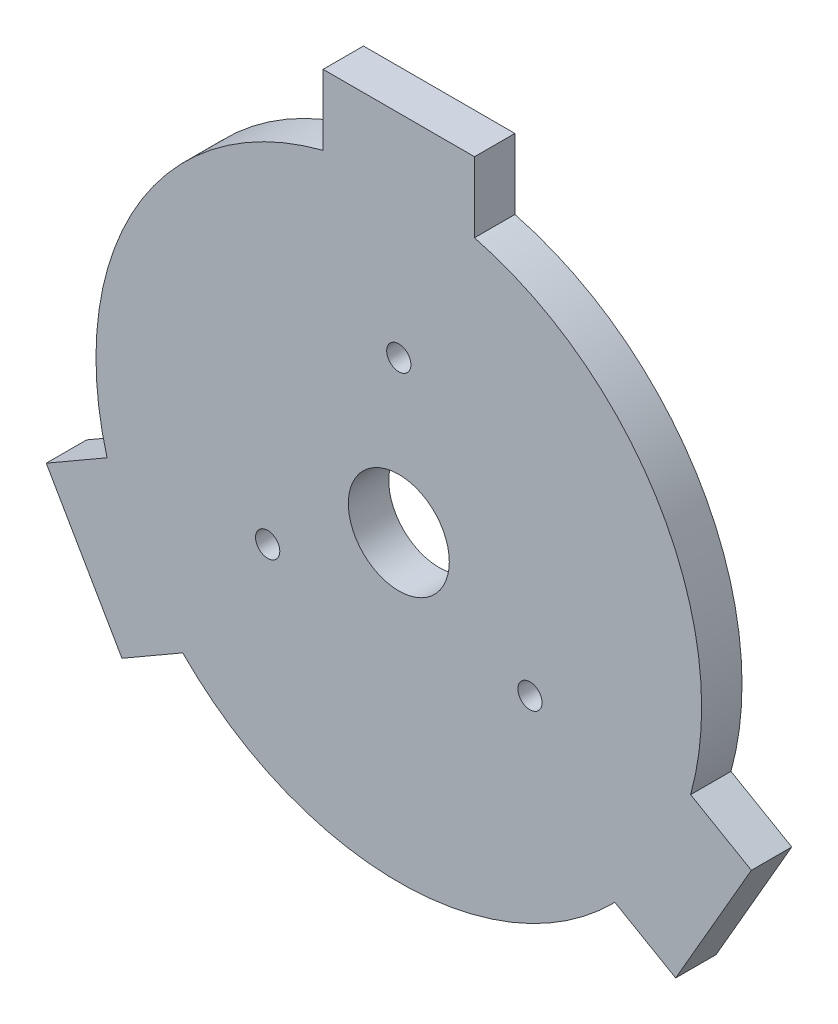
ISO-10303-21;
HEADER;
FILE_DESCRIPTION(('STEP AP214'),'2;1');
FILE_NAME('part.step','',(''),(''),'','','');
FILE_SCHEMA(('AUTOMOTIVE_DESIGN { 1 0 10303 214 1 1 1 1 }'));
ENDSEC;
DATA;
#1=APPLICATION_CONTEXT('core data for automotive mechanical design processes');
#2=APPLICATION_PROTOCOL_DEFINITION('international standard','automotive_design',2000,#1);
#3=PRODUCT_CONTEXT('',#1,'mechanical');
#4=PRODUCT('Part','Part','',(#3));
#5=PRODUCT_RELATED_PRODUCT_CATEGORY('part','',(#4));
#6=PRODUCT_DEFINITION_FORMATION('','',#4);
#7=PRODUCT_DEFINITION_CONTEXT('part definition',#1,'design');
#8=PRODUCT_DEFINITION('design','',#6,#7);
#9=PRODUCT_DEFINITION_SHAPE('','',#8);
#10=(LENGTH_UNIT() NAMED_UNIT(*) SI_UNIT(.MILLI.,.METRE.));
#11=(NAMED_UNIT(*) PLANE_ANGLE_UNIT() SI_UNIT($,.RADIAN.));
#12=(NAMED_UNIT(*) SI_UNIT($,.STERADIAN.) SOLID_ANGLE_UNIT());
#13=UNCERTAINTY_MEASURE_WITH_UNIT(LENGTH_MEASURE(1.E-05),#10,'distance_accuracy_value','');
#14=(GEOMETRIC_REPRESENTATION_CONTEXT(3) GLOBAL_UNCERTAINTY_ASSIGNED_CONTEXT((#13)) GLOBAL_UNIT_ASSIGNED_CONTEXT((#10,
#11,#12)) REPRESENTATION_CONTEXT('',''));
#15=CARTESIAN_POINT('',(0.,0.,0.));
#16=DIRECTION('',(0.,0.,1.));
#17=DIRECTION('',(1.,0.,0.));
#18=AXIS2_PLACEMENT_3D('',#15,#16,#17);
#19=CARTESIAN_POINT('',(0.,0.,4.));
#20=DIRECTION('',(0.,0.,1.));
#21=DIRECTION('',(1.,0.,0.));
#22=AXIS2_PLACEMENT_3D('',#19,#20,#21);
#23=PLANE('',#22);
#24=CARTESIAN_POINT('',(0.,15.,4.));
#25=DIRECTION('',(0.,0.,1.));
#26=DIRECTION('',(1.,0.,0.));
#27=AXIS2_PLACEMENT_3D('',#24,#25,#26);
#28=CIRCLE('',#27,1.2);
#29=CARTESIAN_POINT('',(1.2,15.,4.));
#30=VERTEX_POINT('',#29);
#31=EDGE_CURVE('E176',#30,#30,#28,.T.);
#32=ORIENTED_EDGE('',*,*,#31,.F.);
#33=EDGE_LOOP('',(#32));
#34=FACE_BOUND('',#33,.T.);
#35=CARTESIAN_POINT('',(-12.9903810567665,-7.50000000000006,4.));
#36=DIRECTION('',(0.,0.,1.));
#37=DIRECTION('',(1.,0.,0.));
#38=AXIS2_PLACEMENT_3D('',#35,#36,#37);
#39=CIRCLE('',#38,1.2);
#40=CARTESIAN_POINT('',(-11.7903810567665,-7.50000000000006,4.));
#41=VERTEX_POINT('',#40);
#42=EDGE_CURVE('E166',#41,#41,#39,.T.);
#43=ORIENTED_EDGE('',*,*,#42,.F.);
#44=EDGE_LOOP('',(#43));
#45=FACE_BOUND('',#44,.T.);
#46=CARTESIAN_POINT('',(12.9903810567665,-7.50000000000006,4.));
#47=DIRECTION('',(0.,0.,1.));
#48=DIRECTION('',(1.,0.,0.));
#49=AXIS2_PLACEMENT_3D('',#46,#47,#48);
#50=CIRCLE('',#49,1.2);
#51=CARTESIAN_POINT('',(14.1903810567665,-7.50000000000006,4.));
#52=VERTEX_POINT('',#51);
#53=EDGE_CURVE('E163',#52,#52,#50,.T.);
#54=ORIENTED_EDGE('',*,*,#53,.F.);
#55=EDGE_LOOP('',(#54));
#56=FACE_BOUND('',#55,.T.);
#57=CARTESIAN_POINT('',(0.,0.,4.));
#58=DIRECTION('',(0.,0.,1.));
#59=DIRECTION('',(1.,0.,0.));
#60=AXIS2_PLACEMENT_3D('',#57,#58,#59);
#61=CIRCLE('',#60,5.);
#62=CARTESIAN_POINT('',(5.,0.,4.));
#63=VERTEX_POINT('',#62);
#64=EDGE_CURVE('E224',#63,#63,#61,.T.);
#65=ORIENTED_EDGE('',*,*,#64,.F.);
#66=EDGE_LOOP('',(#65));
#67=FACE_BOUND('',#66,.T.);
#68=DIRECTION('',(0.866025403784438,-0.500000000000002,0.));
#69=VECTOR('',#68,1.);
#70=CARTESIAN_POINT('',(3.74999999999996,6.4951905283832,4.));
#71=LINE('',#70,#69);
#72=CARTESIAN_POINT('',(28.9057647468726,-8.02849701989467,4.));
#73=VERTEX_POINT('',#72);
#74=CARTESIAN_POINT('',(34.9269145362397,-11.5048094716169,4.));
#75=VERTEX_POINT('',#74);
#76=EDGE_CURVE('E134',#73,#75,#71,.T.);
#77=ORIENTED_EDGE('',*,*,#76,.F.);
#78=CARTESIAN_POINT('',(0.,0.,4.));
#79=DIRECTION('',(0.,0.,1.));
#80=DIRECTION('',(1.,0.,0.));
#81=AXIS2_PLACEMENT_3D('',#78,#79,#80);
#82=CIRCLE('',#81,30.);
#83=CARTESIAN_POINT('',(7.5,29.0473750965556,4.));
#84=VERTEX_POINT('',#83);
#85=EDGE_CURVE('E159',#73,#84,#82,.T.);
#86=ORIENTED_EDGE('',*,*,#85,.T.);
#87=DIRECTION('',(0.,-1.,0.));
#88=VECTOR('',#87,1.);
#89=CARTESIAN_POINT('',(7.5,0.,4.));
#90=LINE('',#89,#88);
#91=CARTESIAN_POINT('',(7.5,36.,4.));
#92=VERTEX_POINT('',#91);
#93=EDGE_CURVE('E220',#92,#84,#90,.T.);
#94=ORIENTED_EDGE('',*,*,#93,.F.);
#95=DIRECTION('',(-1.,0.,0.));
#96=VECTOR('',#95,1.);
#97=CARTESIAN_POINT('',(-10.,36.,4.));
#98=LINE('',#97,#96);
#99=CARTESIAN_POINT('',(-7.5,36.,4.));
#100=VERTEX_POINT('',#99);
#101=EDGE_CURVE('E153',#92,#100,#98,.T.);
#102=ORIENTED_EDGE('',*,*,#101,.T.);
#103=DIRECTION('',(0.,1.,0.));
#104=VECTOR('',#103,1.);
#105=CARTESIAN_POINT('',(-7.5,0.,4.));
#106=LINE('',#105,#104);
#107=CARTESIAN_POINT('',(-7.5,29.0473750965556,4.));
#108=VERTEX_POINT('',#107);
#109=EDGE_CURVE('E218',#108,#100,#106,.T.);
#110=ORIENTED_EDGE('',*,*,#109,.F.);
#111=CARTESIAN_POINT('',(0.,0.,4.));
#112=DIRECTION('',(0.,0.,1.));
#113=DIRECTION('',(1.,0.,0.));
#114=AXIS2_PLACEMENT_3D('',#111,#112,#113);
#115=CIRCLE('',#114,30.);
#116=CARTESIAN_POINT('',(-28.9057647468726,-8.02849701989467,4.));
#117=VERTEX_POINT('',#116);
#118=EDGE_CURVE('E232',#108,#117,#115,.T.);
#119=ORIENTED_EDGE('',*,*,#118,.T.);
#120=DIRECTION('',(0.866025403784436,0.500000000000004,0.));
#121=VECTOR('',#120,1.);
#122=CARTESIAN_POINT('',(-3.75000000000003,6.49519052838327,4.));
#123=LINE('',#122,#121);
#124=CARTESIAN_POINT('',(-34.9269145362397,-11.5048094716169,4.));
#125=VERTEX_POINT('',#124);
#126=EDGE_CURVE('E215',#125,#117,#123,.T.);
#127=ORIENTED_EDGE('',*,*,#126,.F.);
#128=DIRECTION('',(0.500000000000004,-0.866025403784436,0.));
#129=VECTOR('',#128,1.);
#130=CARTESIAN_POINT('',(-36.1769145362397,-9.3397459621558,4.));
#131=LINE('',#130,#129);
#132=CARTESIAN_POINT('',(-27.4269145362397,-24.4951905283834,4.));
#133=VERTEX_POINT('',#132);
#134=EDGE_CURVE('E234',#125,#133,#131,.T.);
#135=ORIENTED_EDGE('',*,*,#134,.T.);
#136=DIRECTION('',(-0.866025403784435,-0.500000000000006,0.));
#137=VECTOR('',#136,1.);
#138=CARTESIAN_POINT('',(3.75000000000001,-6.49519052838321,4.));
#139=LINE('',#138,#137);
#140=CARTESIAN_POINT('',(-21.4057647468725,-21.0188780766612,4.));
#141=VERTEX_POINT('',#140);
#142=EDGE_CURVE('E213',#141,#133,#139,.T.);
#143=ORIENTED_EDGE('',*,*,#142,.F.);
#144=CARTESIAN_POINT('',(0.,0.,4.));
#145=DIRECTION('',(0.,0.,1.));
#146=DIRECTION('',(1.,0.,0.));
#147=AXIS2_PLACEMENT_3D('',#144,#145,#146);
#148=CIRCLE('',#147,30.);
#149=CARTESIAN_POINT('',(21.4057647468725,-21.0188780766612,4.));
#150=VERTEX_POINT('',#149);
#151=EDGE_CURVE('E237',#141,#150,#148,.T.);
#152=ORIENTED_EDGE('',*,*,#151,.T.);
#153=DIRECTION('',(-0.866025403784436,0.500000000000004,0.));
#154=VECTOR('',#153,1.);
#155=CARTESIAN_POINT('',(-3.75000000000003,-6.49519052838326,4.));
#156=LINE('',#155,#154);
#157=CARTESIAN_POINT('',(27.4269145362397,-24.4951905283834,4.));
#158=VERTEX_POINT('',#157);
#159=EDGE_CURVE('E179',#158,#150,#156,.T.);
#160=ORIENTED_EDGE('',*,*,#159,.F.);
#161=DIRECTION('',(0.500000000000004,0.866025403784436,0.));
#162=VECTOR('',#161,1.);
#163=CARTESIAN_POINT('',(36.1769145362397,-9.33974596215578,4.));
#164=LINE('',#163,#162);
#165=EDGE_CURVE('E239',#158,#75,#164,.T.);
#166=ORIENTED_EDGE('',*,*,#165,.T.);
#167=EDGE_LOOP('',(#77,#86,#94,#102,#110,#119,#127,#135,#143,#152,#160,#166));
#168=FACE_BOUND('',#167,.T.);
#169=ADVANCED_FACE('F36',(#34,#45,#56,#67,#168),#23,.T.);
#170=CARTESIAN_POINT('',(0.,0.,0.));
#171=DIRECTION('',(0.,0.,1.));
#172=DIRECTION('',(1.,0.,0.));
#173=AXIS2_PLACEMENT_3D('',#170,#171,#172);
#174=PLANE('',#173);
#175=CARTESIAN_POINT('',(0.,15.,0.));
#176=DIRECTION('',(0.,0.,1.));
#177=DIRECTION('',(1.,0.,0.));
#178=AXIS2_PLACEMENT_3D('',#175,#176,#177);
#179=CIRCLE('',#178,1.2);
#180=CARTESIAN_POINT('',(1.2,15.,0.));
#181=VERTEX_POINT('',#180);
#182=EDGE_CURVE('E40',#181,#181,#179,.T.);
#183=ORIENTED_EDGE('',*,*,#182,.T.);
#184=EDGE_LOOP('',(#183));
#185=FACE_BOUND('',#184,.T.);
#186=CARTESIAN_POINT('',(-12.9903810567665,-7.50000000000006,0.));
#187=DIRECTION('',(0.,0.,1.));
#188=DIRECTION('',(1.,0.,0.));
#189=AXIS2_PLACEMENT_3D('',#186,#187,#188);
#190=CIRCLE('',#189,1.2);
#191=CARTESIAN_POINT('',(-11.7903810567665,-7.50000000000006,0.));
#192=VERTEX_POINT('',#191);
#193=EDGE_CURVE('E164',#192,#192,#190,.T.);
#194=ORIENTED_EDGE('',*,*,#193,.T.);
#195=EDGE_LOOP('',(#194));
#196=FACE_BOUND('',#195,.T.);
#197=CARTESIAN_POINT('',(12.9903810567665,-7.50000000000006,0.));
#198=DIRECTION('',(0.,0.,1.));
#199=DIRECTION('',(1.,0.,0.));
#200=AXIS2_PLACEMENT_3D('',#197,#198,#199);
#201=CIRCLE('',#200,1.2);
#202=CARTESIAN_POINT('',(14.1903810567665,-7.50000000000006,0.));
#203=VERTEX_POINT('',#202);
#204=EDGE_CURVE('E161',#203,#203,#201,.T.);
#205=ORIENTED_EDGE('',*,*,#204,.T.);
#206=EDGE_LOOP('',(#205));
#207=FACE_BOUND('',#206,.T.);
#208=CARTESIAN_POINT('',(0.,0.,0.));
#209=DIRECTION('',(0.,0.,1.));
#210=DIRECTION('',(1.,0.,0.));
#211=AXIS2_PLACEMENT_3D('',#208,#209,#210);
#212=CIRCLE('',#211,5.);
#213=CARTESIAN_POINT('',(5.,0.,0.));
#214=VERTEX_POINT('',#213);
#215=EDGE_CURVE('E223',#214,#214,#212,.T.);
#216=ORIENTED_EDGE('',*,*,#215,.T.);
#217=EDGE_LOOP('',(#216));
#218=FACE_BOUND('',#217,.T.);
#219=CARTESIAN_POINT('',(0.,0.,0.));
#220=DIRECTION('',(0.,0.,1.));
#221=DIRECTION('',(1.,0.,0.));
#222=AXIS2_PLACEMENT_3D('',#219,#220,#221);
#223=CIRCLE('',#222,30.);
#224=CARTESIAN_POINT('',(28.9057647468726,-8.02849701989467,0.));
#225=VERTEX_POINT('',#224);
#226=CARTESIAN_POINT('',(7.5,29.0473750965556,0.));
#227=VERTEX_POINT('',#226);
#228=EDGE_CURVE('E146',#225,#227,#223,.T.);
#229=ORIENTED_EDGE('',*,*,#228,.F.);
#230=DIRECTION('',(-0.866025403784438,0.500000000000002,0.));
#231=VECTOR('',#230,1.);
#232=CARTESIAN_POINT('',(34.9269145362397,-11.5048094716169,0.));
#233=LINE('',#232,#231);
#234=CARTESIAN_POINT('',(34.9269145362397,-11.5048094716169,0.));
#235=VERTEX_POINT('',#234);
#236=EDGE_CURVE('E132',#235,#225,#233,.T.);
#237=ORIENTED_EDGE('',*,*,#236,.F.);
#238=DIRECTION('',(0.500000000000004,0.866025403784436,0.));
#239=VECTOR('',#238,1.);
#240=CARTESIAN_POINT('',(36.1769145362397,-9.33974596215578,0.));
#241=LINE('',#240,#239);
#242=CARTESIAN_POINT('',(27.4269145362397,-24.4951905283834,0.));
#243=VERTEX_POINT('',#242);
#244=EDGE_CURVE('E144',#243,#235,#241,.T.);
#245=ORIENTED_EDGE('',*,*,#244,.F.);
#246=DIRECTION('',(0.866025403784436,-0.500000000000004,0.));
#247=VECTOR('',#246,1.);
#248=CARTESIAN_POINT('',(21.4057647468725,-21.0188780766612,0.));
#249=LINE('',#248,#247);
#250=CARTESIAN_POINT('',(21.4057647468725,-21.0188780766612,0.));
#251=VERTEX_POINT('',#250);
#252=EDGE_CURVE('E60',#251,#243,#249,.T.);
#253=ORIENTED_EDGE('',*,*,#252,.F.);
#254=CARTESIAN_POINT('',(0.,0.,0.));
#255=DIRECTION('',(0.,0.,1.));
#256=DIRECTION('',(1.,0.,0.));
#257=AXIS2_PLACEMENT_3D('',#254,#255,#256);
#258=CIRCLE('',#257,30.);
#259=CARTESIAN_POINT('',(-21.4057647468725,-21.0188780766612,0.));
#260=VERTEX_POINT('',#259);
#261=EDGE_CURVE('E151',#260,#251,#258,.T.);
#262=ORIENTED_EDGE('',*,*,#261,.F.);
#263=DIRECTION('',(0.866025403784435,0.500000000000006,0.));
#264=VECTOR('',#263,1.);
#265=CARTESIAN_POINT('',(-27.4269145362397,-24.4951905283834,0.));
#266=LINE('',#265,#264);
#267=CARTESIAN_POINT('',(-27.4269145362397,-24.4951905283834,0.));
#268=VERTEX_POINT('',#267);
#269=EDGE_CURVE('E200',#268,#260,#266,.T.);
#270=ORIENTED_EDGE('',*,*,#269,.F.);
#271=DIRECTION('',(0.500000000000004,-0.866025403784436,0.));
#272=VECTOR('',#271,1.);
#273=CARTESIAN_POINT('',(-36.1769145362397,-9.3397459621558,0.));
#274=LINE('',#273,#272);
#275=CARTESIAN_POINT('',(-34.9269145362397,-11.5048094716169,0.));
#276=VERTEX_POINT('',#275);
#277=EDGE_CURVE('E155',#276,#268,#274,.T.);
#278=ORIENTED_EDGE('',*,*,#277,.F.);
#279=DIRECTION('',(-0.866025403784436,-0.500000000000004,0.));
#280=VECTOR('',#279,1.);
#281=CARTESIAN_POINT('',(-28.9057647468726,-8.02849701989467,0.));
#282=LINE('',#281,#280);
#283=CARTESIAN_POINT('',(-28.9057647468726,-8.02849701989467,0.));
#284=VERTEX_POINT('',#283);
#285=EDGE_CURVE('E53',#284,#276,#282,.T.);
#286=ORIENTED_EDGE('',*,*,#285,.F.);
#287=CARTESIAN_POINT('',(0.,0.,0.));
#288=DIRECTION('',(0.,0.,1.));
#289=DIRECTION('',(1.,0.,0.));
#290=AXIS2_PLACEMENT_3D('',#287,#288,#289);
#291=CIRCLE('',#290,30.);
#292=CARTESIAN_POINT('',(-7.5,29.0473750965556,0.));
#293=VERTEX_POINT('',#292);
#294=EDGE_CURVE('E244',#293,#284,#291,.T.);
#295=ORIENTED_EDGE('',*,*,#294,.F.);
#296=DIRECTION('',(0.,-1.,0.));
#297=VECTOR('',#296,1.);
#298=CARTESIAN_POINT('',(-7.5,36.,0.));
#299=LINE('',#298,#297);
#300=CARTESIAN_POINT('',(-7.5,36.,0.));
#301=VERTEX_POINT('',#300);
#302=EDGE_CURVE('E189',#301,#293,#299,.T.);
#303=ORIENTED_EDGE('',*,*,#302,.F.);
#304=DIRECTION('',(-1.,0.,0.));
#305=VECTOR('',#304,1.);
#306=CARTESIAN_POINT('',(-10.,36.,0.));
#307=LINE('',#306,#305);
#308=CARTESIAN_POINT('',(7.5,36.,0.));
#309=VERTEX_POINT('',#308);
#310=EDGE_CURVE('E227',#309,#301,#307,.T.);
#311=ORIENTED_EDGE('',*,*,#310,.F.);
#312=DIRECTION('',(0.,1.,0.));
#313=VECTOR('',#312,1.);
#314=CARTESIAN_POINT('',(7.5,29.0473750965556,0.));
#315=LINE('',#314,#313);
#316=EDGE_CURVE('E181',#227,#309,#315,.T.);
#317=ORIENTED_EDGE('',*,*,#316,.F.);
#318=EDGE_LOOP('',(#229,#237,#245,#253,#262,#270,#278,#286,#295,#303,#311,#317));
#319=FACE_BOUND('',#318,.T.);
#320=ADVANCED_FACE('F143',(#185,#196,#207,#218,#319),#174,.F.);
#321=CARTESIAN_POINT('',(-10.,36.,4.));
#322=DIRECTION('',(0.,-1.,0.));
#323=DIRECTION('',(0.,0.,-1.));
#324=AXIS2_PLACEMENT_3D('',#321,#322,#323);
#325=PLANE('',#324);
#326=ORIENTED_EDGE('',*,*,#101,.F.);
#327=DIRECTION('',(0.,0.,-1.));
#328=VECTOR('',#327,1.);
#329=CARTESIAN_POINT('',(7.5,36.,10.));
#330=LINE('',#329,#328);
#331=EDGE_CURVE('E148',#92,#309,#330,.T.);
#332=ORIENTED_EDGE('',*,*,#331,.T.);
#333=ORIENTED_EDGE('',*,*,#310,.T.);
#334=DIRECTION('',(0.,0.,-1.));
#335=VECTOR('',#334,1.);
#336=CARTESIAN_POINT('',(-7.5,36.,10.));
#337=LINE('',#336,#335);
#338=EDGE_CURVE('E192',#100,#301,#337,.T.);
#339=ORIENTED_EDGE('',*,*,#338,.F.);
#340=EDGE_LOOP('',(#326,#332,#333,#339));
#341=FACE_BOUND('',#340,.T.);
#342=ADVANCED_FACE('F38',(#341),#325,.F.);
#343=CARTESIAN_POINT('',(0.,0.,4.));
#344=DIRECTION('',(0.,0.,-1.));
#345=DIRECTION('',(-1.,0.,0.));
#346=AXIS2_PLACEMENT_3D('',#343,#344,#345);
#347=CYLINDRICAL_SURFACE('',#346,30.);
#348=ORIENTED_EDGE('',*,*,#294,.T.);
#349=DIRECTION('',(0.,0.,-1.));
#350=VECTOR('',#349,1.);
#351=CARTESIAN_POINT('',(-28.9057647468726,-8.02849701989467,10.));
#352=LINE('',#351,#350);
#353=EDGE_CURVE('E193',#117,#284,#352,.T.);
#354=ORIENTED_EDGE('',*,*,#353,.F.);
#355=ORIENTED_EDGE('',*,*,#118,.F.);
#356=DIRECTION('',(0.,0.,-1.));
#357=VECTOR('',#356,1.);
#358=CARTESIAN_POINT('',(-7.5,29.0473750965556,10.));
#359=LINE('',#358,#357);
#360=EDGE_CURVE('E184',#108,#293,#359,.T.);
#361=ORIENTED_EDGE('',*,*,#360,.T.);
#362=EDGE_LOOP('',(#348,#354,#355,#361));
#363=FACE_BOUND('',#362,.T.);
#364=ADVANCED_FACE('F263',(#363),#347,.T.);
#365=CARTESIAN_POINT('',(-36.1769145362397,-9.3397459621558,4.));
#366=DIRECTION('',(0.866025403784436,0.500000000000004,0.));
#367=DIRECTION('',(-0.500000000000004,0.866025403784436,0.));
#368=AXIS2_PLACEMENT_3D('',#365,#366,#367);
#369=PLANE('',#368);
#370=ORIENTED_EDGE('',*,*,#134,.F.);
#371=DIRECTION('',(0.,0.,-1.));
#372=VECTOR('',#371,1.);
#373=CARTESIAN_POINT('',(-34.9269145362397,-11.5048094716169,4.));
#374=LINE('',#373,#372);
#375=EDGE_CURVE('E11',#125,#276,#374,.T.);
#376=ORIENTED_EDGE('',*,*,#375,.T.);
#377=ORIENTED_EDGE('',*,*,#277,.T.);
#378=DIRECTION('',(0.,0.,-1.));
#379=VECTOR('',#378,1.);
#380=CARTESIAN_POINT('',(-27.4269145362397,-24.4951905283834,10.));
#381=LINE('',#380,#379);
#382=EDGE_CURVE('E203',#133,#268,#381,.T.);
#383=ORIENTED_EDGE('',*,*,#382,.F.);
#384=EDGE_LOOP('',(#370,#376,#377,#383));
#385=FACE_BOUND('',#384,.T.);
#386=ADVANCED_FACE('F250',(#385),#369,.F.);
#387=CARTESIAN_POINT('',(0.,0.,4.));
#388=DIRECTION('',(0.,0.,-1.));
#389=DIRECTION('',(-1.,0.,0.));
#390=AXIS2_PLACEMENT_3D('',#387,#388,#389);
#391=CYLINDRICAL_SURFACE('',#390,30.);
#392=ORIENTED_EDGE('',*,*,#261,.T.);
#393=DIRECTION('',(0.,0.,-1.));
#394=VECTOR('',#393,1.);
#395=CARTESIAN_POINT('',(21.4057647468725,-21.0188780766612,10.));
#396=LINE('',#395,#394);
#397=EDGE_CURVE('E204',#150,#251,#396,.T.);
#398=ORIENTED_EDGE('',*,*,#397,.F.);
#399=ORIENTED_EDGE('',*,*,#151,.F.);
#400=DIRECTION('',(0.,0.,-1.));
#401=VECTOR('',#400,1.);
#402=CARTESIAN_POINT('',(-21.4057647468725,-21.0188780766612,10.));
#403=LINE('',#402,#401);
#404=EDGE_CURVE('E198',#141,#260,#403,.T.);
#405=ORIENTED_EDGE('',*,*,#404,.T.);
#406=EDGE_LOOP('',(#392,#398,#399,#405));
#407=FACE_BOUND('',#406,.T.);
#408=ADVANCED_FACE('F288',(#407),#391,.T.);
#409=CARTESIAN_POINT('',(36.1769145362397,-9.33974596215578,4.));
#410=DIRECTION('',(-0.866025403784436,0.500000000000004,0.));
#411=DIRECTION('',(-0.500000000000004,-0.866025403784436,0.));
#412=AXIS2_PLACEMENT_3D('',#409,#410,#411);
#413=PLANE('',#412);
#414=ORIENTED_EDGE('',*,*,#244,.T.);
#415=DIRECTION('',(0.,0.,-1.));
#416=VECTOR('',#415,1.);
#417=CARTESIAN_POINT('',(34.9269145362397,-11.5048094716169,10.));
#418=LINE('',#417,#416);
#419=EDGE_CURVE('E128',#75,#235,#418,.T.);
#420=ORIENTED_EDGE('',*,*,#419,.F.);
#421=ORIENTED_EDGE('',*,*,#165,.F.);
#422=DIRECTION('',(0.,0.,-1.));
#423=VECTOR('',#422,1.);
#424=CARTESIAN_POINT('',(27.4269145362397,-24.4951905283834,4.));
#425=LINE('',#424,#423);
#426=EDGE_CURVE('E45',#158,#243,#425,.T.);
#427=ORIENTED_EDGE('',*,*,#426,.T.);
#428=EDGE_LOOP('',(#414,#420,#421,#427));
#429=FACE_BOUND('',#428,.T.);
#430=ADVANCED_FACE('F150',(#429),#413,.F.);
#431=CARTESIAN_POINT('',(0.,0.,4.));
#432=DIRECTION('',(0.,0.,-1.));
#433=DIRECTION('',(-1.,0.,0.));
#434=AXIS2_PLACEMENT_3D('',#431,#432,#433);
#435=CYLINDRICAL_SURFACE('',#434,30.);
#436=ORIENTED_EDGE('',*,*,#228,.T.);
#437=DIRECTION('',(0.,0.,-1.));
#438=VECTOR('',#437,1.);
#439=CARTESIAN_POINT('',(7.5,29.0473750965556,10.));
#440=LINE('',#439,#438);
#441=EDGE_CURVE('E183',#84,#227,#440,.T.);
#442=ORIENTED_EDGE('',*,*,#441,.F.);
#443=ORIENTED_EDGE('',*,*,#85,.F.);
#444=DIRECTION('',(0.,0.,-1.));
#445=VECTOR('',#444,1.);
#446=CARTESIAN_POINT('',(28.9057647468726,-8.02849701989467,10.));
#447=LINE('',#446,#445);
#448=EDGE_CURVE('E139',#73,#225,#447,.T.);
#449=ORIENTED_EDGE('',*,*,#448,.T.);
#450=EDGE_LOOP('',(#436,#442,#443,#449));
#451=FACE_BOUND('',#450,.T.);
#452=ADVANCED_FACE('F276',(#451),#435,.T.);
#453=CARTESIAN_POINT('',(0.,0.,4.));
#454=DIRECTION('',(0.,0.,-1.));
#455=DIRECTION('',(-1.,0.,0.));
#456=AXIS2_PLACEMENT_3D('',#453,#454,#455);
#457=CYLINDRICAL_SURFACE('',#456,5.);
#458=ORIENTED_EDGE('',*,*,#64,.T.);
#459=EDGE_LOOP('',(#458));
#460=FACE_BOUND('',#459,.T.);
#461=ORIENTED_EDGE('',*,*,#215,.F.);
#462=EDGE_LOOP('',(#461));
#463=FACE_BOUND('',#462,.T.);
#464=ADVANCED_FACE('F278',(#460,#463),#457,.F.);
#465=CARTESIAN_POINT('',(7.5,29.0473750965556,10.));
#466=DIRECTION('',(-1.,0.,0.));
#467=DIRECTION('',(0.,0.,1.));
#468=AXIS2_PLACEMENT_3D('',#465,#466,#467);
#469=PLANE('',#468);
#470=ORIENTED_EDGE('',*,*,#93,.T.);
#471=ORIENTED_EDGE('',*,*,#441,.T.);
#472=ORIENTED_EDGE('',*,*,#316,.T.);
#473=ORIENTED_EDGE('',*,*,#331,.F.);
#474=EDGE_LOOP('',(#470,#471,#472,#473));
#475=FACE_BOUND('',#474,.T.);
#476=ADVANCED_FACE('F273',(#475),#469,.F.);
#477=CARTESIAN_POINT('',(34.9269145362397,-11.5048094716169,10.));
#478=DIRECTION('',(-0.500000000000002,-0.866025403784438,0.));
#479=DIRECTION('',(0.866025403784438,-0.500000000000002,0.));
#480=AXIS2_PLACEMENT_3D('',#477,#478,#479);
#481=PLANE('',#480);
#482=ORIENTED_EDGE('',*,*,#76,.T.);
#483=ORIENTED_EDGE('',*,*,#419,.T.);
#484=ORIENTED_EDGE('',*,*,#236,.T.);
#485=ORIENTED_EDGE('',*,*,#448,.F.);
#486=EDGE_LOOP('',(#482,#483,#484,#485));
#487=FACE_BOUND('',#486,.T.);
#488=ADVANCED_FACE('F130',(#487),#481,.F.);
#489=CARTESIAN_POINT('',(21.4057647468725,-21.0188780766612,10.));
#490=DIRECTION('',(0.500000000000004,0.866025403784436,0.));
#491=DIRECTION('',(-0.866025403784436,0.500000000000004,0.));
#492=AXIS2_PLACEMENT_3D('',#489,#490,#491);
#493=PLANE('',#492);
#494=ORIENTED_EDGE('',*,*,#159,.T.);
#495=ORIENTED_EDGE('',*,*,#397,.T.);
#496=ORIENTED_EDGE('',*,*,#252,.T.);
#497=ORIENTED_EDGE('',*,*,#426,.F.);
#498=EDGE_LOOP('',(#494,#495,#496,#497));
#499=FACE_BOUND('',#498,.T.);
#500=ADVANCED_FACE('F302',(#499),#493,.F.);
#501=CARTESIAN_POINT('',(-27.4269145362397,-24.4951905283834,10.));
#502=DIRECTION('',(-0.500000000000006,0.866025403784435,0.));
#503=DIRECTION('',(-0.866025403784435,-0.500000000000006,0.));
#504=AXIS2_PLACEMENT_3D('',#501,#502,#503);
#505=PLANE('',#504);
#506=ORIENTED_EDGE('',*,*,#142,.T.);
#507=ORIENTED_EDGE('',*,*,#382,.T.);
#508=ORIENTED_EDGE('',*,*,#269,.T.);
#509=ORIENTED_EDGE('',*,*,#404,.F.);
#510=EDGE_LOOP('',(#506,#507,#508,#509));
#511=FACE_BOUND('',#510,.T.);
#512=ADVANCED_FACE('F254',(#511),#505,.F.);
#513=CARTESIAN_POINT('',(-28.9057647468726,-8.02849701989467,10.));
#514=DIRECTION('',(0.500000000000004,-0.866025403784436,0.));
#515=DIRECTION('',(0.866025403784436,0.500000000000004,0.));
#516=AXIS2_PLACEMENT_3D('',#513,#514,#515);
#517=PLANE('',#516);
#518=ORIENTED_EDGE('',*,*,#126,.T.);
#519=ORIENTED_EDGE('',*,*,#353,.T.);
#520=ORIENTED_EDGE('',*,*,#285,.T.);
#521=ORIENTED_EDGE('',*,*,#375,.F.);
#522=EDGE_LOOP('',(#518,#519,#520,#521));
#523=FACE_BOUND('',#522,.T.);
#524=ADVANCED_FACE('F261',(#523),#517,.F.);
#525=CARTESIAN_POINT('',(-7.5,36.,10.));
#526=DIRECTION('',(1.,0.,0.));
#527=DIRECTION('',(0.,0.,-1.));
#528=AXIS2_PLACEMENT_3D('',#525,#526,#527);
#529=PLANE('',#528);
#530=ORIENTED_EDGE('',*,*,#109,.T.);
#531=ORIENTED_EDGE('',*,*,#338,.T.);
#532=ORIENTED_EDGE('',*,*,#302,.T.);
#533=ORIENTED_EDGE('',*,*,#360,.F.);
#534=EDGE_LOOP('',(#530,#531,#532,#533));
#535=FACE_BOUND('',#534,.T.);
#536=ADVANCED_FACE('F309',(#535),#529,.F.);
#537=CARTESIAN_POINT('',(12.9903810567665,-7.50000000000006,5.));
#538=DIRECTION('',(0.,0.,-1.));
#539=DIRECTION('',(-1.,0.,0.));
#540=AXIS2_PLACEMENT_3D('',#537,#538,#539);
#541=CYLINDRICAL_SURFACE('',#540,1.2);
#542=ORIENTED_EDGE('',*,*,#53,.T.);
#543=EDGE_LOOP('',(#542));
#544=FACE_BOUND('',#543,.T.);
#545=ORIENTED_EDGE('',*,*,#204,.F.);
#546=EDGE_LOOP('',(#545));
#547=FACE_BOUND('',#546,.T.);
#548=ADVANCED_FACE('F312',(#544,#547),#541,.F.);
#549=CARTESIAN_POINT('',(-12.9903810567665,-7.50000000000006,5.));
#550=DIRECTION('',(0.,0.,-1.));
#551=DIRECTION('',(-1.,0.,0.));
#552=AXIS2_PLACEMENT_3D('',#549,#550,#551);
#553=CYLINDRICAL_SURFACE('',#552,1.2);
#554=ORIENTED_EDGE('',*,*,#42,.T.);
#555=EDGE_LOOP('',(#554));
#556=FACE_BOUND('',#555,.T.);
#557=ORIENTED_EDGE('',*,*,#193,.F.);
#558=EDGE_LOOP('',(#557));
#559=FACE_BOUND('',#558,.T.);
#560=ADVANCED_FACE('F318',(#556,#559),#553,.F.);
#561=CARTESIAN_POINT('',(0.,15.,5.));
#562=DIRECTION('',(0.,0.,-1.));
#563=DIRECTION('',(-1.,0.,0.));
#564=AXIS2_PLACEMENT_3D('',#561,#562,#563);
#565=CYLINDRICAL_SURFACE('',#564,1.2);
#566=ORIENTED_EDGE('',*,*,#31,.T.);
#567=EDGE_LOOP('',(#566));
#568=FACE_BOUND('',#567,.T.);
#569=ORIENTED_EDGE('',*,*,#182,.F.);
#570=EDGE_LOOP('',(#569));
#571=FACE_BOUND('',#570,.T.);
#572=ADVANCED_FACE('F321',(#568,#571),#565,.F.);
#573=CLOSED_SHELL('',(#169,#320,#342,#364,#386,#408,#430,#452,#464,#476,#488,#500,#512,#524,
#536,#548,#560,#572));
#574=MANIFOLD_SOLID_BREP('B2',#573);
#575=ADVANCED_BREP_SHAPE_REPRESENTATION('',(#18,#574),#14);
#576=SHAPE_DEFINITION_REPRESENTATION(#9,#575);
ENDSEC;
END-ISO-10303-21;
